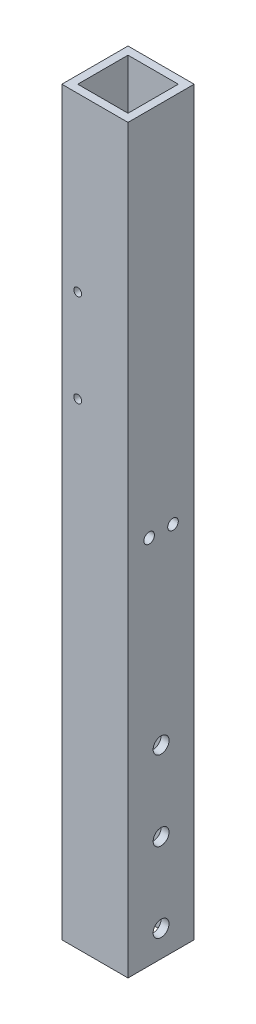
ISO-10303-21;
HEADER;
FILE_DESCRIPTION(('STEP AP214'),'2;1');
FILE_NAME('part.step','',(''),(''),'','','');
FILE_SCHEMA(('AUTOMOTIVE_DESIGN { 1 0 10303 214 1 1 1 1 }'));
ENDSEC;
DATA;
#1=APPLICATION_CONTEXT('core data for automotive mechanical design processes');
#2=APPLICATION_PROTOCOL_DEFINITION('international standard','automotive_design',2000,#1);
#3=PRODUCT_CONTEXT('',#1,'mechanical');
#4=PRODUCT('Part','Part','',(#3));
#5=PRODUCT_RELATED_PRODUCT_CATEGORY('part','',(#4));
#6=PRODUCT_DEFINITION_FORMATION('','',#4);
#7=PRODUCT_DEFINITION_CONTEXT('part definition',#1,'design');
#8=PRODUCT_DEFINITION('design','',#6,#7);
#9=PRODUCT_DEFINITION_SHAPE('','',#8);
#10=(LENGTH_UNIT() NAMED_UNIT(*) SI_UNIT(.MILLI.,.METRE.));
#11=(NAMED_UNIT(*) PLANE_ANGLE_UNIT() SI_UNIT($,.RADIAN.));
#12=(NAMED_UNIT(*) SI_UNIT($,.STERADIAN.) SOLID_ANGLE_UNIT());
#13=UNCERTAINTY_MEASURE_WITH_UNIT(LENGTH_MEASURE(1.E-05),#10,'distance_accuracy_value','');
#14=(GEOMETRIC_REPRESENTATION_CONTEXT(3) GLOBAL_UNCERTAINTY_ASSIGNED_CONTEXT((#13)) GLOBAL_UNIT_ASSIGNED_CONTEXT((#10,
#11,#12)) REPRESENTATION_CONTEXT('',''));
#15=CARTESIAN_POINT('',(0.,0.,0.));
#16=DIRECTION('',(0.,0.,1.));
#17=DIRECTION('',(1.,0.,0.));
#18=AXIS2_PLACEMENT_3D('',#15,#16,#17);
#19=CARTESIAN_POINT('',(0.,280.,0.));
#20=DIRECTION('',(0.,-1.,0.));
#21=DIRECTION('',(0.,0.,-1.));
#22=AXIS2_PLACEMENT_3D('',#19,#20,#21);
#23=PLANE('',#22);
#24=DIRECTION('',(0.,0.,1.));
#25=VECTOR('',#24,1.);
#26=CARTESIAN_POINT('',(0.,280.,0.));
#27=LINE('',#26,#25);
#28=CARTESIAN_POINT('',(0.,280.,-25.));
#29=VERTEX_POINT('',#28);
#30=CARTESIAN_POINT('',(0.,280.,0.));
#31=VERTEX_POINT('',#30);
#32=EDGE_CURVE('E142',#29,#31,#27,.T.);
#33=ORIENTED_EDGE('',*,*,#32,.T.);
#34=DIRECTION('',(1.,0.,0.));
#35=VECTOR('',#34,1.);
#36=CARTESIAN_POINT('',(0.,280.,0.));
#37=LINE('',#36,#35);
#38=CARTESIAN_POINT('',(25.,280.,0.));
#39=VERTEX_POINT('',#38);
#40=EDGE_CURVE('E145',#31,#39,#37,.T.);
#41=ORIENTED_EDGE('',*,*,#40,.T.);
#42=DIRECTION('',(0.,0.,-1.));
#43=VECTOR('',#42,1.);
#44=CARTESIAN_POINT('',(25.,280.,0.));
#45=LINE('',#44,#43);
#46=CARTESIAN_POINT('',(25.,280.,-25.));
#47=VERTEX_POINT('',#46);
#48=EDGE_CURVE('E148',#39,#47,#45,.T.);
#49=ORIENTED_EDGE('',*,*,#48,.T.);
#50=DIRECTION('',(-1.,0.,0.));
#51=VECTOR('',#50,1.);
#52=CARTESIAN_POINT('',(0.,280.,-25.));
#53=LINE('',#52,#51);
#54=EDGE_CURVE('E150',#47,#29,#53,.T.);
#55=ORIENTED_EDGE('',*,*,#54,.T.);
#56=EDGE_LOOP('',(#33,#41,#49,#55));
#57=FACE_BOUND('',#56,.T.);
#58=DIRECTION('',(0.,0.,1.));
#59=VECTOR('',#58,1.);
#60=CARTESIAN_POINT('',(3.,280.,-3.));
#61=LINE('',#60,#59);
#62=CARTESIAN_POINT('',(3.,280.,-22.));
#63=VERTEX_POINT('',#62);
#64=CARTESIAN_POINT('',(3.,280.,-3.));
#65=VERTEX_POINT('',#64);
#66=EDGE_CURVE('E104',#63,#65,#61,.T.);
#67=ORIENTED_EDGE('',*,*,#66,.F.);
#68=DIRECTION('',(-1.,0.,0.));
#69=VECTOR('',#68,1.);
#70=CARTESIAN_POINT('',(3.,280.,-22.));
#71=LINE('',#70,#69);
#72=CARTESIAN_POINT('',(22.,280.,-22.));
#73=VERTEX_POINT('',#72);
#74=EDGE_CURVE('E126',#73,#63,#71,.T.);
#75=ORIENTED_EDGE('',*,*,#74,.F.);
#76=DIRECTION('',(0.,0.,-1.));
#77=VECTOR('',#76,1.);
#78=CARTESIAN_POINT('',(22.,280.,-3.));
#79=LINE('',#78,#77);
#80=CARTESIAN_POINT('',(22.,280.,-3.));
#81=VERTEX_POINT('',#80);
#82=EDGE_CURVE('E124',#81,#73,#79,.T.);
#83=ORIENTED_EDGE('',*,*,#82,.F.);
#84=DIRECTION('',(1.,0.,0.));
#85=VECTOR('',#84,1.);
#86=CARTESIAN_POINT('',(3.,280.,-3.));
#87=LINE('',#86,#85);
#88=EDGE_CURVE('E112',#65,#81,#87,.T.);
#89=ORIENTED_EDGE('',*,*,#88,.F.);
#90=EDGE_LOOP('',(#67,#75,#83,#89));
#91=FACE_BOUND('',#90,.T.);
#92=ADVANCED_FACE('F37',(#57,#91),#23,.F.);
#93=CARTESIAN_POINT('',(0.,0.,0.));
#94=DIRECTION('',(0.,-1.,0.));
#95=DIRECTION('',(0.,0.,-1.));
#96=AXIS2_PLACEMENT_3D('',#93,#94,#95);
#97=PLANE('',#96);
#98=DIRECTION('',(0.,0.,1.));
#99=VECTOR('',#98,1.);
#100=CARTESIAN_POINT('',(0.,0.,0.));
#101=LINE('',#100,#99);
#102=CARTESIAN_POINT('',(0.,0.,-25.));
#103=VERTEX_POINT('',#102);
#104=CARTESIAN_POINT('',(0.,0.,0.));
#105=VERTEX_POINT('',#104);
#106=EDGE_CURVE('E120',#103,#105,#101,.T.);
#107=ORIENTED_EDGE('',*,*,#106,.F.);
#108=DIRECTION('',(-1.,0.,0.));
#109=VECTOR('',#108,1.);
#110=CARTESIAN_POINT('',(0.,0.,-25.));
#111=LINE('',#110,#109);
#112=CARTESIAN_POINT('',(25.,0.,-25.));
#113=VERTEX_POINT('',#112);
#114=EDGE_CURVE('E146',#113,#103,#111,.T.);
#115=ORIENTED_EDGE('',*,*,#114,.F.);
#116=DIRECTION('',(0.,0.,-1.));
#117=VECTOR('',#116,1.);
#118=CARTESIAN_POINT('',(25.,0.,0.));
#119=LINE('',#118,#117);
#120=CARTESIAN_POINT('',(25.,0.,0.));
#121=VERTEX_POINT('',#120);
#122=EDGE_CURVE('E157',#121,#113,#119,.T.);
#123=ORIENTED_EDGE('',*,*,#122,.F.);
#124=DIRECTION('',(1.,0.,0.));
#125=VECTOR('',#124,1.);
#126=CARTESIAN_POINT('',(0.,0.,0.));
#127=LINE('',#126,#125);
#128=EDGE_CURVE('E155',#105,#121,#127,.T.);
#129=ORIENTED_EDGE('',*,*,#128,.F.);
#130=EDGE_LOOP('',(#107,#115,#123,#129));
#131=FACE_BOUND('',#130,.T.);
#132=DIRECTION('',(-1.,0.,0.));
#133=VECTOR('',#132,1.);
#134=CARTESIAN_POINT('',(3.,0.,-22.));
#135=LINE('',#134,#133);
#136=CARTESIAN_POINT('',(22.,0.,-22.));
#137=VERTEX_POINT('',#136);
#138=CARTESIAN_POINT('',(3.,0.,-22.));
#139=VERTEX_POINT('',#138);
#140=EDGE_CURVE('E113',#137,#139,#135,.T.);
#141=ORIENTED_EDGE('',*,*,#140,.T.);
#142=DIRECTION('',(0.,0.,1.));
#143=VECTOR('',#142,1.);
#144=CARTESIAN_POINT('',(3.,0.,-3.));
#145=LINE('',#144,#143);
#146=CARTESIAN_POINT('',(3.,0.,-3.));
#147=VERTEX_POINT('',#146);
#148=EDGE_CURVE('E62',#139,#147,#145,.T.);
#149=ORIENTED_EDGE('',*,*,#148,.T.);
#150=DIRECTION('',(1.,0.,0.));
#151=VECTOR('',#150,1.);
#152=CARTESIAN_POINT('',(3.,0.,-3.));
#153=LINE('',#152,#151);
#154=CARTESIAN_POINT('',(22.,0.,-3.));
#155=VERTEX_POINT('',#154);
#156=EDGE_CURVE('E119',#147,#155,#153,.T.);
#157=ORIENTED_EDGE('',*,*,#156,.T.);
#158=DIRECTION('',(0.,0.,-1.));
#159=VECTOR('',#158,1.);
#160=CARTESIAN_POINT('',(22.,0.,-3.));
#161=LINE('',#160,#159);
#162=EDGE_CURVE('E134',#155,#137,#161,.T.);
#163=ORIENTED_EDGE('',*,*,#162,.T.);
#164=EDGE_LOOP('',(#141,#149,#157,#163));
#165=FACE_BOUND('',#164,.T.);
#166=ADVANCED_FACE('F264',(#131,#165),#97,.T.);
#167=CARTESIAN_POINT('',(0.,280.,0.));
#168=DIRECTION('',(1.,0.,0.));
#169=DIRECTION('',(0.,0.,-1.));
#170=AXIS2_PLACEMENT_3D('',#167,#168,#169);
#171=PLANE('',#170);
#172=CARTESIAN_POINT('',(0.,10.,-12.5));
#173=DIRECTION('',(1.,0.,0.));
#174=DIRECTION('',(0.,0.,-1.));
#175=AXIS2_PLACEMENT_3D('',#172,#173,#174);
#176=CIRCLE('',#175,3.);
#177=CARTESIAN_POINT('',(0.,10.,-15.5));
#178=VERTEX_POINT('',#177);
#179=EDGE_CURVE('E214',#178,#178,#176,.T.);
#180=ORIENTED_EDGE('',*,*,#179,.T.);
#181=EDGE_LOOP('',(#180));
#182=FACE_BOUND('',#181,.T.);
#183=CARTESIAN_POINT('',(0.,40.,-12.4999999999999));
#184=DIRECTION('',(1.,0.,0.));
#185=DIRECTION('',(0.,0.,-1.));
#186=AXIS2_PLACEMENT_3D('',#183,#184,#185);
#187=CIRCLE('',#186,3.);
#188=CARTESIAN_POINT('',(0.,40.,-15.4999999999999));
#189=VERTEX_POINT('',#188);
#190=EDGE_CURVE('E220',#189,#189,#187,.T.);
#191=ORIENTED_EDGE('',*,*,#190,.T.);
#192=EDGE_LOOP('',(#191));
#193=FACE_BOUND('',#192,.T.);
#194=CARTESIAN_POINT('',(0.,70.,-12.4999999999998));
#195=DIRECTION('',(1.,0.,0.));
#196=DIRECTION('',(0.,0.,-1.));
#197=AXIS2_PLACEMENT_3D('',#194,#195,#196);
#198=CIRCLE('',#197,3.);
#199=CARTESIAN_POINT('',(0.,70.,-15.4999999999998));
#200=VERTEX_POINT('',#199);
#201=EDGE_CURVE('E226',#200,#200,#198,.T.);
#202=ORIENTED_EDGE('',*,*,#201,.T.);
#203=EDGE_LOOP('',(#202));
#204=FACE_BOUND('',#203,.T.);
#205=CARTESIAN_POINT('',(0.,140.,-17.));
#206=DIRECTION('',(1.,0.,0.));
#207=DIRECTION('',(0.,0.,-1.));
#208=AXIS2_PLACEMENT_3D('',#205,#206,#207);
#209=CIRCLE('',#208,2.);
#210=CARTESIAN_POINT('',(0.,140.,-19.));
#211=VERTEX_POINT('',#210);
#212=EDGE_CURVE('E232',#211,#211,#209,.T.);
#213=ORIENTED_EDGE('',*,*,#212,.T.);
#214=EDGE_LOOP('',(#213));
#215=FACE_BOUND('',#214,.T.);
#216=CARTESIAN_POINT('',(0.,140.,-8.));
#217=DIRECTION('',(1.,0.,0.));
#218=DIRECTION('',(0.,0.,-1.));
#219=AXIS2_PLACEMENT_3D('',#216,#217,#218);
#220=CIRCLE('',#219,2.);
#221=CARTESIAN_POINT('',(0.,140.,-10.));
#222=VERTEX_POINT('',#221);
#223=EDGE_CURVE('E211',#222,#222,#220,.T.);
#224=ORIENTED_EDGE('',*,*,#223,.T.);
#225=EDGE_LOOP('',(#224));
#226=FACE_BOUND('',#225,.T.);
#227=ORIENTED_EDGE('',*,*,#106,.T.);
#228=DIRECTION('',(0.,-1.,0.));
#229=VECTOR('',#228,1.);
#230=CARTESIAN_POINT('',(0.,280.,0.));
#231=LINE('',#230,#229);
#232=EDGE_CURVE('E11',#31,#105,#231,.T.);
#233=ORIENTED_EDGE('',*,*,#232,.F.);
#234=ORIENTED_EDGE('',*,*,#32,.F.);
#235=DIRECTION('',(0.,-1.,0.));
#236=VECTOR('',#235,1.);
#237=CARTESIAN_POINT('',(0.,280.,-25.));
#238=LINE('',#237,#236);
#239=EDGE_CURVE('E152',#29,#103,#238,.T.);
#240=ORIENTED_EDGE('',*,*,#239,.T.);
#241=EDGE_LOOP('',(#227,#233,#234,#240));
#242=FACE_BOUND('',#241,.T.);
#243=ADVANCED_FACE('F39',(#182,#193,#204,#215,#226,#242),#171,.F.);
#244=CARTESIAN_POINT('',(0.,280.,0.));
#245=DIRECTION('',(0.,0.,-1.));
#246=DIRECTION('',(-1.,0.,0.));
#247=AXIS2_PLACEMENT_3D('',#244,#245,#246);
#248=PLANE('',#247);
#249=CARTESIAN_POINT('',(6.,180.,0.));
#250=DIRECTION('',(0.,0.,1.));
#251=DIRECTION('',(1.,0.,0.));
#252=AXIS2_PLACEMENT_3D('',#249,#250,#251);
#253=CIRCLE('',#252,1.5);
#254=CARTESIAN_POINT('',(7.5,180.,0.));
#255=VERTEX_POINT('',#254);
#256=EDGE_CURVE('E195',#255,#255,#253,.T.);
#257=ORIENTED_EDGE('',*,*,#256,.F.);
#258=EDGE_LOOP('',(#257));
#259=FACE_BOUND('',#258,.T.);
#260=CARTESIAN_POINT('',(5.99999999999988,215.,0.));
#261=DIRECTION('',(0.,0.,1.));
#262=DIRECTION('',(1.,0.,0.));
#263=AXIS2_PLACEMENT_3D('',#260,#261,#262);
#264=CIRCLE('',#263,1.5);
#265=CARTESIAN_POINT('',(7.49999999999988,215.,0.));
#266=VERTEX_POINT('',#265);
#267=EDGE_CURVE('E205',#266,#266,#264,.T.);
#268=ORIENTED_EDGE('',*,*,#267,.F.);
#269=EDGE_LOOP('',(#268));
#270=FACE_BOUND('',#269,.T.);
#271=ORIENTED_EDGE('',*,*,#128,.T.);
#272=DIRECTION('',(0.,-1.,0.));
#273=VECTOR('',#272,1.);
#274=CARTESIAN_POINT('',(25.,280.,0.));
#275=LINE('',#274,#273);
#276=EDGE_CURVE('E46',#39,#121,#275,.T.);
#277=ORIENTED_EDGE('',*,*,#276,.F.);
#278=ORIENTED_EDGE('',*,*,#40,.F.);
#279=ORIENTED_EDGE('',*,*,#232,.T.);
#280=EDGE_LOOP('',(#271,#277,#278,#279));
#281=FACE_BOUND('',#280,.T.);
#282=ADVANCED_FACE('F263',(#259,#270,#281),#248,.F.);
#283=CARTESIAN_POINT('',(25.,280.,0.));
#284=DIRECTION('',(-1.,0.,0.));
#285=DIRECTION('',(0.,0.,1.));
#286=AXIS2_PLACEMENT_3D('',#283,#284,#285);
#287=PLANE('',#286);
#288=CARTESIAN_POINT('',(25.,10.,-12.5));
#289=DIRECTION('',(1.,0.,0.));
#290=DIRECTION('',(0.,0.,-1.));
#291=AXIS2_PLACEMENT_3D('',#288,#289,#290);
#292=CIRCLE('',#291,3.);
#293=CARTESIAN_POINT('',(25.,10.,-15.5));
#294=VERTEX_POINT('',#293);
#295=EDGE_CURVE('E171',#294,#294,#292,.T.);
#296=ORIENTED_EDGE('',*,*,#295,.F.);
#297=EDGE_LOOP('',(#296));
#298=FACE_BOUND('',#297,.T.);
#299=CARTESIAN_POINT('',(25.,40.,-12.4999999999999));
#300=DIRECTION('',(1.,0.,0.));
#301=DIRECTION('',(0.,0.,-1.));
#302=AXIS2_PLACEMENT_3D('',#299,#300,#301);
#303=CIRCLE('',#302,3.);
#304=CARTESIAN_POINT('',(25.,40.,-15.4999999999999));
#305=VERTEX_POINT('',#304);
#306=EDGE_CURVE('E217',#305,#305,#303,.T.);
#307=ORIENTED_EDGE('',*,*,#306,.F.);
#308=EDGE_LOOP('',(#307));
#309=FACE_BOUND('',#308,.T.);
#310=CARTESIAN_POINT('',(25.,70.,-12.4999999999998));
#311=DIRECTION('',(1.,0.,0.));
#312=DIRECTION('',(0.,0.,-1.));
#313=AXIS2_PLACEMENT_3D('',#310,#311,#312);
#314=CIRCLE('',#313,3.);
#315=CARTESIAN_POINT('',(25.,70.,-15.4999999999998));
#316=VERTEX_POINT('',#315);
#317=EDGE_CURVE('E223',#316,#316,#314,.T.);
#318=ORIENTED_EDGE('',*,*,#317,.F.);
#319=EDGE_LOOP('',(#318));
#320=FACE_BOUND('',#319,.T.);
#321=CARTESIAN_POINT('',(25.,140.,-17.));
#322=DIRECTION('',(1.,0.,0.));
#323=DIRECTION('',(0.,0.,-1.));
#324=AXIS2_PLACEMENT_3D('',#321,#322,#323);
#325=CIRCLE('',#324,2.);
#326=CARTESIAN_POINT('',(25.,140.,-19.));
#327=VERTEX_POINT('',#326);
#328=EDGE_CURVE('E229',#327,#327,#325,.T.);
#329=ORIENTED_EDGE('',*,*,#328,.F.);
#330=EDGE_LOOP('',(#329));
#331=FACE_BOUND('',#330,.T.);
#332=CARTESIAN_POINT('',(25.,140.,-8.));
#333=DIRECTION('',(1.,0.,0.));
#334=DIRECTION('',(0.,0.,-1.));
#335=AXIS2_PLACEMENT_3D('',#332,#333,#334);
#336=CIRCLE('',#335,2.);
#337=CARTESIAN_POINT('',(25.,140.,-10.));
#338=VERTEX_POINT('',#337);
#339=EDGE_CURVE('E235',#338,#338,#336,.T.);
#340=ORIENTED_EDGE('',*,*,#339,.F.);
#341=EDGE_LOOP('',(#340));
#342=FACE_BOUND('',#341,.T.);
#343=ORIENTED_EDGE('',*,*,#122,.T.);
#344=DIRECTION('',(0.,-1.,0.));
#345=VECTOR('',#344,1.);
#346=CARTESIAN_POINT('',(25.,280.,-25.));
#347=LINE('',#346,#345);
#348=EDGE_CURVE('E162',#47,#113,#347,.T.);
#349=ORIENTED_EDGE('',*,*,#348,.F.);
#350=ORIENTED_EDGE('',*,*,#48,.F.);
#351=ORIENTED_EDGE('',*,*,#276,.T.);
#352=EDGE_LOOP('',(#343,#349,#350,#351));
#353=FACE_BOUND('',#352,.T.);
#354=ADVANCED_FACE('F290',(#298,#309,#320,#331,#342,#353),#287,.F.);
#355=CARTESIAN_POINT('',(0.,280.,-25.));
#356=DIRECTION('',(0.,0.,1.));
#357=DIRECTION('',(1.,0.,0.));
#358=AXIS2_PLACEMENT_3D('',#355,#356,#357);
#359=PLANE('',#358);
#360=CARTESIAN_POINT('',(6.,180.,-25.));
#361=DIRECTION('',(0.,0.,1.));
#362=DIRECTION('',(1.,0.,0.));
#363=AXIS2_PLACEMENT_3D('',#360,#361,#362);
#364=CIRCLE('',#363,1.5);
#365=CARTESIAN_POINT('',(7.5,180.,-25.));
#366=VERTEX_POINT('',#365);
#367=EDGE_CURVE('E189',#366,#366,#364,.T.);
#368=ORIENTED_EDGE('',*,*,#367,.T.);
#369=EDGE_LOOP('',(#368));
#370=FACE_BOUND('',#369,.T.);
#371=CARTESIAN_POINT('',(5.99999999999988,215.,-25.));
#372=DIRECTION('',(0.,0.,1.));
#373=DIRECTION('',(1.,0.,0.));
#374=AXIS2_PLACEMENT_3D('',#371,#372,#373);
#375=CIRCLE('',#374,1.5);
#376=CARTESIAN_POINT('',(7.49999999999988,215.,-25.));
#377=VERTEX_POINT('',#376);
#378=EDGE_CURVE('E200',#377,#377,#375,.T.);
#379=ORIENTED_EDGE('',*,*,#378,.T.);
#380=EDGE_LOOP('',(#379));
#381=FACE_BOUND('',#380,.T.);
#382=ORIENTED_EDGE('',*,*,#114,.T.);
#383=ORIENTED_EDGE('',*,*,#239,.F.);
#384=ORIENTED_EDGE('',*,*,#54,.F.);
#385=ORIENTED_EDGE('',*,*,#348,.T.);
#386=EDGE_LOOP('',(#382,#383,#384,#385));
#387=FACE_BOUND('',#386,.T.);
#388=ADVANCED_FACE('F288',(#370,#381,#387),#359,.F.);
#389=CARTESIAN_POINT('',(3.,280.,-3.));
#390=DIRECTION('',(1.,0.,0.));
#391=DIRECTION('',(0.,0.,-1.));
#392=AXIS2_PLACEMENT_3D('',#389,#390,#391);
#393=PLANE('',#392);
#394=CARTESIAN_POINT('',(3.,10.,-12.5));
#395=DIRECTION('',(1.,0.,0.));
#396=DIRECTION('',(0.,0.,-1.));
#397=AXIS2_PLACEMENT_3D('',#394,#395,#396);
#398=CIRCLE('',#397,3.);
#399=CARTESIAN_POINT('',(3.,10.,-15.5));
#400=VERTEX_POINT('',#399);
#401=EDGE_CURVE('E132',#400,#400,#398,.F.);
#402=ORIENTED_EDGE('',*,*,#401,.T.);
#403=EDGE_LOOP('',(#402));
#404=FACE_BOUND('',#403,.T.);
#405=CARTESIAN_POINT('',(3.,40.,-12.4999999999999));
#406=DIRECTION('',(1.,0.,0.));
#407=DIRECTION('',(0.,0.,-1.));
#408=AXIS2_PLACEMENT_3D('',#405,#406,#407);
#409=CIRCLE('',#408,3.);
#410=CARTESIAN_POINT('',(3.,40.,-15.4999999999999));
#411=VERTEX_POINT('',#410);
#412=EDGE_CURVE('E183',#411,#411,#409,.F.);
#413=ORIENTED_EDGE('',*,*,#412,.T.);
#414=EDGE_LOOP('',(#413));
#415=FACE_BOUND('',#414,.T.);
#416=CARTESIAN_POINT('',(3.,70.,-12.4999999999998));
#417=DIRECTION('',(1.,0.,0.));
#418=DIRECTION('',(0.,0.,-1.));
#419=AXIS2_PLACEMENT_3D('',#416,#417,#418);
#420=CIRCLE('',#419,3.);
#421=CARTESIAN_POINT('',(3.,70.,-15.4999999999998));
#422=VERTEX_POINT('',#421);
#423=EDGE_CURVE('E179',#422,#422,#420,.F.);
#424=ORIENTED_EDGE('',*,*,#423,.T.);
#425=EDGE_LOOP('',(#424));
#426=FACE_BOUND('',#425,.T.);
#427=CARTESIAN_POINT('',(3.,140.,-17.));
#428=DIRECTION('',(1.,0.,0.));
#429=DIRECTION('',(0.,0.,-1.));
#430=AXIS2_PLACEMENT_3D('',#427,#428,#429);
#431=CIRCLE('',#430,2.);
#432=CARTESIAN_POINT('',(3.,140.,-19.));
#433=VERTEX_POINT('',#432);
#434=EDGE_CURVE('E175',#433,#433,#431,.F.);
#435=ORIENTED_EDGE('',*,*,#434,.T.);
#436=EDGE_LOOP('',(#435));
#437=FACE_BOUND('',#436,.T.);
#438=CARTESIAN_POINT('',(3.,140.,-8.));
#439=DIRECTION('',(1.,0.,0.));
#440=DIRECTION('',(0.,0.,-1.));
#441=AXIS2_PLACEMENT_3D('',#438,#439,#440);
#442=CIRCLE('',#441,2.);
#443=CARTESIAN_POINT('',(3.,140.,-10.));
#444=VERTEX_POINT('',#443);
#445=EDGE_CURVE('E170',#444,#444,#442,.F.);
#446=ORIENTED_EDGE('',*,*,#445,.T.);
#447=EDGE_LOOP('',(#446));
#448=FACE_BOUND('',#447,.T.);
#449=ORIENTED_EDGE('',*,*,#148,.F.);
#450=DIRECTION('',(0.,-1.,0.));
#451=VECTOR('',#450,1.);
#452=CARTESIAN_POINT('',(3.,280.,-22.));
#453=LINE('',#452,#451);
#454=EDGE_CURVE('E108',#63,#139,#453,.T.);
#455=ORIENTED_EDGE('',*,*,#454,.F.);
#456=ORIENTED_EDGE('',*,*,#66,.T.);
#457=DIRECTION('',(0.,-1.,0.));
#458=VECTOR('',#457,1.);
#459=CARTESIAN_POINT('',(3.,280.,-3.));
#460=LINE('',#459,#458);
#461=EDGE_CURVE('E107',#65,#147,#460,.T.);
#462=ORIENTED_EDGE('',*,*,#461,.T.);
#463=EDGE_LOOP('',(#449,#455,#456,#462));
#464=FACE_BOUND('',#463,.T.);
#465=ADVANCED_FACE('F106',(#404,#415,#426,#437,#448,#464),#393,.T.);
#466=CARTESIAN_POINT('',(3.,280.,-3.));
#467=DIRECTION('',(0.,0.,-1.));
#468=DIRECTION('',(-1.,0.,0.));
#469=AXIS2_PLACEMENT_3D('',#466,#467,#468);
#470=PLANE('',#469);
#471=CARTESIAN_POINT('',(6.,180.,-3.));
#472=DIRECTION('',(0.,0.,-1.));
#473=DIRECTION('',(-1.,0.,0.));
#474=AXIS2_PLACEMENT_3D('',#471,#472,#473);
#475=CIRCLE('',#474,1.5);
#476=CARTESIAN_POINT('',(4.5,180.,-3.));
#477=VERTEX_POINT('',#476);
#478=EDGE_CURVE('E208',#477,#477,#475,.T.);
#479=ORIENTED_EDGE('',*,*,#478,.F.);
#480=EDGE_LOOP('',(#479));
#481=FACE_BOUND('',#480,.T.);
#482=CARTESIAN_POINT('',(5.99999999999988,215.,-3.));
#483=DIRECTION('',(0.,0.,-1.));
#484=DIRECTION('',(-1.,0.,0.));
#485=AXIS2_PLACEMENT_3D('',#482,#483,#484);
#486=CIRCLE('',#485,1.5);
#487=CARTESIAN_POINT('',(4.49999999999988,215.,-3.));
#488=VERTEX_POINT('',#487);
#489=EDGE_CURVE('E188',#488,#488,#486,.T.);
#490=ORIENTED_EDGE('',*,*,#489,.F.);
#491=EDGE_LOOP('',(#490));
#492=FACE_BOUND('',#491,.T.);
#493=ORIENTED_EDGE('',*,*,#156,.F.);
#494=ORIENTED_EDGE('',*,*,#461,.F.);
#495=ORIENTED_EDGE('',*,*,#88,.T.);
#496=DIRECTION('',(0.,-1.,0.));
#497=VECTOR('',#496,1.);
#498=CARTESIAN_POINT('',(22.,280.,-3.));
#499=LINE('',#498,#497);
#500=EDGE_CURVE('E121',#81,#155,#499,.T.);
#501=ORIENTED_EDGE('',*,*,#500,.T.);
#502=EDGE_LOOP('',(#493,#494,#495,#501));
#503=FACE_BOUND('',#502,.T.);
#504=ADVANCED_FACE('F116',(#481,#492,#503),#470,.T.);
#505=CARTESIAN_POINT('',(22.,280.,-3.));
#506=DIRECTION('',(-1.,0.,0.));
#507=DIRECTION('',(0.,0.,1.));
#508=AXIS2_PLACEMENT_3D('',#505,#506,#507);
#509=PLANE('',#508);
#510=CARTESIAN_POINT('',(22.,10.,-12.5));
#511=DIRECTION('',(-1.,0.,0.));
#512=DIRECTION('',(0.,0.,1.));
#513=AXIS2_PLACEMENT_3D('',#510,#511,#512);
#514=CIRCLE('',#513,3.);
#515=CARTESIAN_POINT('',(22.,10.,-9.5));
#516=VERTEX_POINT('',#515);
#517=EDGE_CURVE('E184',#516,#516,#514,.F.);
#518=ORIENTED_EDGE('',*,*,#517,.T.);
#519=EDGE_LOOP('',(#518));
#520=FACE_BOUND('',#519,.T.);
#521=CARTESIAN_POINT('',(22.,40.,-12.4999999999999));
#522=DIRECTION('',(-1.,0.,0.));
#523=DIRECTION('',(0.,0.,1.));
#524=AXIS2_PLACEMENT_3D('',#521,#522,#523);
#525=CIRCLE('',#524,3.);
#526=CARTESIAN_POINT('',(22.,40.,-9.4999999999999));
#527=VERTEX_POINT('',#526);
#528=EDGE_CURVE('E180',#527,#527,#525,.F.);
#529=ORIENTED_EDGE('',*,*,#528,.T.);
#530=EDGE_LOOP('',(#529));
#531=FACE_BOUND('',#530,.T.);
#532=CARTESIAN_POINT('',(22.,70.,-12.4999999999998));
#533=DIRECTION('',(-1.,0.,0.));
#534=DIRECTION('',(0.,0.,1.));
#535=AXIS2_PLACEMENT_3D('',#532,#533,#534);
#536=CIRCLE('',#535,3.);
#537=CARTESIAN_POINT('',(22.,70.,-9.49999999999979));
#538=VERTEX_POINT('',#537);
#539=EDGE_CURVE('E176',#538,#538,#536,.F.);
#540=ORIENTED_EDGE('',*,*,#539,.T.);
#541=EDGE_LOOP('',(#540));
#542=FACE_BOUND('',#541,.T.);
#543=CARTESIAN_POINT('',(22.,140.,-17.));
#544=DIRECTION('',(-1.,0.,0.));
#545=DIRECTION('',(0.,0.,1.));
#546=AXIS2_PLACEMENT_3D('',#543,#544,#545);
#547=CIRCLE('',#546,2.);
#548=CARTESIAN_POINT('',(22.,140.,-15.));
#549=VERTEX_POINT('',#548);
#550=EDGE_CURVE('E172',#549,#549,#547,.F.);
#551=ORIENTED_EDGE('',*,*,#550,.T.);
#552=EDGE_LOOP('',(#551));
#553=FACE_BOUND('',#552,.T.);
#554=CARTESIAN_POINT('',(22.,140.,-8.));
#555=DIRECTION('',(-1.,0.,0.));
#556=DIRECTION('',(0.,0.,1.));
#557=AXIS2_PLACEMENT_3D('',#554,#555,#556);
#558=CIRCLE('',#557,2.);
#559=CARTESIAN_POINT('',(22.,140.,-6.));
#560=VERTEX_POINT('',#559);
#561=EDGE_CURVE('E167',#560,#560,#558,.F.);
#562=ORIENTED_EDGE('',*,*,#561,.T.);
#563=EDGE_LOOP('',(#562));
#564=FACE_BOUND('',#563,.T.);
#565=ORIENTED_EDGE('',*,*,#162,.F.);
#566=ORIENTED_EDGE('',*,*,#500,.F.);
#567=ORIENTED_EDGE('',*,*,#82,.T.);
#568=DIRECTION('',(0.,-1.,0.));
#569=VECTOR('',#568,1.);
#570=CARTESIAN_POINT('',(22.,280.,-22.));
#571=LINE('',#570,#569);
#572=EDGE_CURVE('E54',#73,#137,#571,.T.);
#573=ORIENTED_EDGE('',*,*,#572,.T.);
#574=EDGE_LOOP('',(#565,#566,#567,#573));
#575=FACE_BOUND('',#574,.T.);
#576=ADVANCED_FACE('F313',(#520,#531,#542,#553,#564,#575),#509,.T.);
#577=CARTESIAN_POINT('',(3.,280.,-22.));
#578=DIRECTION('',(0.,0.,1.));
#579=DIRECTION('',(1.,0.,0.));
#580=AXIS2_PLACEMENT_3D('',#577,#578,#579);
#581=PLANE('',#580);
#582=CARTESIAN_POINT('',(6.,180.,-22.));
#583=DIRECTION('',(0.,0.,1.));
#584=DIRECTION('',(1.,0.,0.));
#585=AXIS2_PLACEMENT_3D('',#582,#583,#584);
#586=CIRCLE('',#585,1.5);
#587=CARTESIAN_POINT('',(7.5,180.,-22.));
#588=VERTEX_POINT('',#587);
#589=EDGE_CURVE('E41',#588,#588,#586,.T.);
#590=ORIENTED_EDGE('',*,*,#589,.F.);
#591=EDGE_LOOP('',(#590));
#592=FACE_BOUND('',#591,.T.);
#593=CARTESIAN_POINT('',(5.99999999999988,215.,-22.));
#594=DIRECTION('',(0.,0.,1.));
#595=DIRECTION('',(1.,0.,0.));
#596=AXIS2_PLACEMENT_3D('',#593,#594,#595);
#597=CIRCLE('',#596,1.5);
#598=CARTESIAN_POINT('',(7.49999999999988,215.,-22.));
#599=VERTEX_POINT('',#598);
#600=EDGE_CURVE('E186',#599,#599,#597,.T.);
#601=ORIENTED_EDGE('',*,*,#600,.F.);
#602=EDGE_LOOP('',(#601));
#603=FACE_BOUND('',#602,.T.);
#604=ORIENTED_EDGE('',*,*,#140,.F.);
#605=ORIENTED_EDGE('',*,*,#572,.F.);
#606=ORIENTED_EDGE('',*,*,#74,.T.);
#607=ORIENTED_EDGE('',*,*,#454,.T.);
#608=EDGE_LOOP('',(#604,#605,#606,#607));
#609=FACE_BOUND('',#608,.T.);
#610=ADVANCED_FACE('F317',(#592,#603,#609),#581,.T.);
#611=CARTESIAN_POINT('',(25.,140.,-8.));
#612=DIRECTION('',(-1.,0.,0.));
#613=DIRECTION('',(0.,0.,1.));
#614=AXIS2_PLACEMENT_3D('',#611,#612,#613);
#615=CYLINDRICAL_SURFACE('',#614,2.);
#616=ORIENTED_EDGE('',*,*,#561,.F.);
#617=EDGE_LOOP('',(#616));
#618=FACE_BOUND('',#617,.T.);
#619=ORIENTED_EDGE('',*,*,#339,.T.);
#620=EDGE_LOOP('',(#619));
#621=FACE_BOUND('',#620,.T.);
#622=ADVANCED_FACE('F321',(#618,#621),#615,.F.);
#623=CARTESIAN_POINT('',(25.,140.,-17.));
#624=DIRECTION('',(-1.,0.,0.));
#625=DIRECTION('',(0.,0.,1.));
#626=AXIS2_PLACEMENT_3D('',#623,#624,#625);
#627=CYLINDRICAL_SURFACE('',#626,2.);
#628=ORIENTED_EDGE('',*,*,#550,.F.);
#629=EDGE_LOOP('',(#628));
#630=FACE_BOUND('',#629,.T.);
#631=ORIENTED_EDGE('',*,*,#328,.T.);
#632=EDGE_LOOP('',(#631));
#633=FACE_BOUND('',#632,.T.);
#634=ADVANCED_FACE('F325',(#630,#633),#627,.F.);
#635=CARTESIAN_POINT('',(25.,70.,-12.4999999999998));
#636=DIRECTION('',(-1.,0.,0.));
#637=DIRECTION('',(0.,0.,1.));
#638=AXIS2_PLACEMENT_3D('',#635,#636,#637);
#639=CYLINDRICAL_SURFACE('',#638,3.);
#640=ORIENTED_EDGE('',*,*,#539,.F.);
#641=EDGE_LOOP('',(#640));
#642=FACE_BOUND('',#641,.T.);
#643=ORIENTED_EDGE('',*,*,#317,.T.);
#644=EDGE_LOOP('',(#643));
#645=FACE_BOUND('',#644,.T.);
#646=ADVANCED_FACE('F330',(#642,#645),#639,.F.);
#647=CARTESIAN_POINT('',(25.,40.,-12.4999999999999));
#648=DIRECTION('',(-1.,0.,0.));
#649=DIRECTION('',(0.,0.,1.));
#650=AXIS2_PLACEMENT_3D('',#647,#648,#649);
#651=CYLINDRICAL_SURFACE('',#650,3.);
#652=ORIENTED_EDGE('',*,*,#528,.F.);
#653=EDGE_LOOP('',(#652));
#654=FACE_BOUND('',#653,.T.);
#655=ORIENTED_EDGE('',*,*,#306,.T.);
#656=EDGE_LOOP('',(#655));
#657=FACE_BOUND('',#656,.T.);
#658=ADVANCED_FACE('F335',(#654,#657),#651,.F.);
#659=CARTESIAN_POINT('',(25.,10.,-12.5));
#660=DIRECTION('',(-1.,0.,0.));
#661=DIRECTION('',(0.,0.,1.));
#662=AXIS2_PLACEMENT_3D('',#659,#660,#661);
#663=CYLINDRICAL_SURFACE('',#662,3.);
#664=ORIENTED_EDGE('',*,*,#517,.F.);
#665=EDGE_LOOP('',(#664));
#666=FACE_BOUND('',#665,.T.);
#667=ORIENTED_EDGE('',*,*,#295,.T.);
#668=EDGE_LOOP('',(#667));
#669=FACE_BOUND('',#668,.T.);
#670=ADVANCED_FACE('F258',(#666,#669),#663,.F.);
#671=ORIENTED_EDGE('',*,*,#445,.F.);
#672=EDGE_LOOP('',(#671));
#673=FACE_BOUND('',#672,.T.);
#674=ORIENTED_EDGE('',*,*,#223,.F.);
#675=EDGE_LOOP('',(#674));
#676=FACE_BOUND('',#675,.T.);
#677=ADVANCED_FACE('F327',(#673,#676),#615,.F.);
#678=ORIENTED_EDGE('',*,*,#434,.F.);
#679=EDGE_LOOP('',(#678));
#680=FACE_BOUND('',#679,.T.);
#681=ORIENTED_EDGE('',*,*,#212,.F.);
#682=EDGE_LOOP('',(#681));
#683=FACE_BOUND('',#682,.T.);
#684=ADVANCED_FACE('F332',(#680,#683),#627,.F.);
#685=ORIENTED_EDGE('',*,*,#423,.F.);
#686=EDGE_LOOP('',(#685));
#687=FACE_BOUND('',#686,.T.);
#688=ORIENTED_EDGE('',*,*,#201,.F.);
#689=EDGE_LOOP('',(#688));
#690=FACE_BOUND('',#689,.T.);
#691=ADVANCED_FACE('F337',(#687,#690),#639,.F.);
#692=ORIENTED_EDGE('',*,*,#412,.F.);
#693=EDGE_LOOP('',(#692));
#694=FACE_BOUND('',#693,.T.);
#695=ORIENTED_EDGE('',*,*,#190,.F.);
#696=EDGE_LOOP('',(#695));
#697=FACE_BOUND('',#696,.T.);
#698=ADVANCED_FACE('F256',(#694,#697),#651,.F.);
#699=ORIENTED_EDGE('',*,*,#401,.F.);
#700=EDGE_LOOP('',(#699));
#701=FACE_BOUND('',#700,.T.);
#702=ORIENTED_EDGE('',*,*,#179,.F.);
#703=EDGE_LOOP('',(#702));
#704=FACE_BOUND('',#703,.T.);
#705=ADVANCED_FACE('F252',(#701,#704),#663,.F.);
#706=CARTESIAN_POINT('',(5.99999999999988,215.,-25.));
#707=DIRECTION('',(0.,0.,1.));
#708=DIRECTION('',(1.,0.,0.));
#709=AXIS2_PLACEMENT_3D('',#706,#707,#708);
#710=CYLINDRICAL_SURFACE('',#709,1.5);
#711=ORIENTED_EDGE('',*,*,#600,.T.);
#712=EDGE_LOOP('',(#711));
#713=FACE_BOUND('',#712,.T.);
#714=ORIENTED_EDGE('',*,*,#378,.F.);
#715=EDGE_LOOP('',(#714));
#716=FACE_BOUND('',#715,.T.);
#717=ADVANCED_FACE('F255',(#713,#716),#710,.F.);
#718=CARTESIAN_POINT('',(6.,180.,-25.));
#719=DIRECTION('',(0.,0.,1.));
#720=DIRECTION('',(1.,0.,0.));
#721=AXIS2_PLACEMENT_3D('',#718,#719,#720);
#722=CYLINDRICAL_SURFACE('',#721,1.5);
#723=ORIENTED_EDGE('',*,*,#589,.T.);
#724=EDGE_LOOP('',(#723));
#725=FACE_BOUND('',#724,.T.);
#726=ORIENTED_EDGE('',*,*,#367,.F.);
#727=EDGE_LOOP('',(#726));
#728=FACE_BOUND('',#727,.T.);
#729=ADVANCED_FACE('F345',(#725,#728),#722,.F.);
#730=ORIENTED_EDGE('',*,*,#489,.T.);
#731=EDGE_LOOP('',(#730));
#732=FACE_BOUND('',#731,.T.);
#733=ORIENTED_EDGE('',*,*,#267,.T.);
#734=EDGE_LOOP('',(#733));
#735=FACE_BOUND('',#734,.T.);
#736=ADVANCED_FACE('F346',(#732,#735),#710,.F.);
#737=ORIENTED_EDGE('',*,*,#478,.T.);
#738=EDGE_LOOP('',(#737));
#739=FACE_BOUND('',#738,.T.);
#740=ORIENTED_EDGE('',*,*,#256,.T.);
#741=EDGE_LOOP('',(#740));
#742=FACE_BOUND('',#741,.T.);
#743=ADVANCED_FACE('F349',(#739,#742),#722,.F.);
#744=CLOSED_SHELL('',(#92,#166,#243,#282,#354,#388,#465,#504,#576,#610,#622,#634,#646,#658,#670,
#677,#684,#691,#698,#705,#717,#729,#736,#743));
#745=MANIFOLD_SOLID_BREP('B2',#744);
#746=ADVANCED_BREP_SHAPE_REPRESENTATION('',(#18,#745),#14);
#747=SHAPE_DEFINITION_REPRESENTATION(#9,#746);
ENDSEC;
END-ISO-10303-21;
